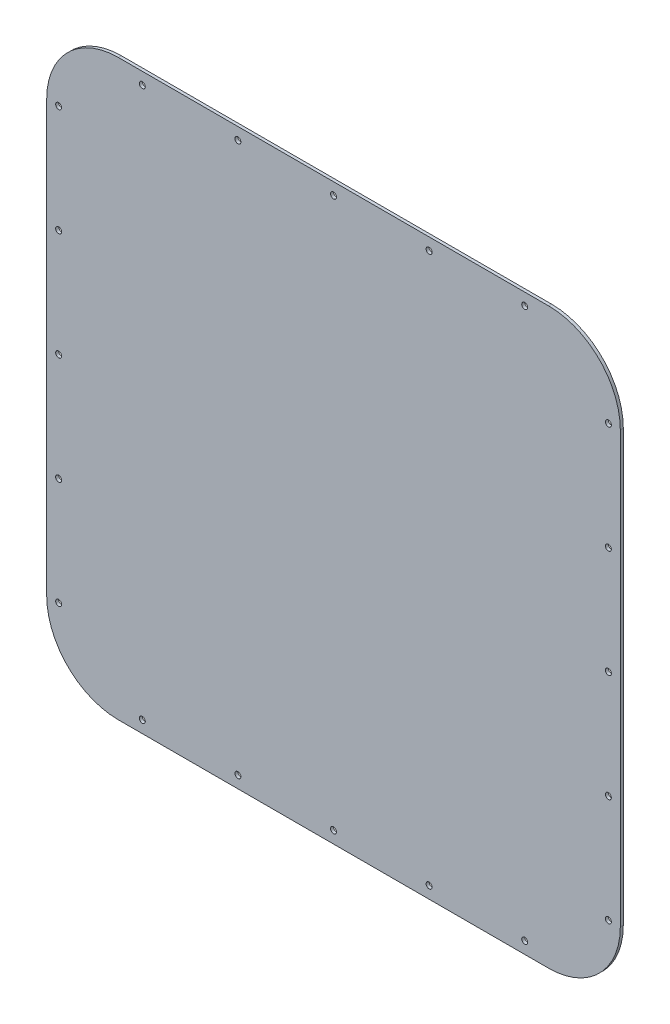
ISO-10303-21;
HEADER;
FILE_DESCRIPTION(('STEP AP214'),'2;1');
FILE_NAME('part.step','',(''),(''),'','','');
FILE_SCHEMA(('AUTOMOTIVE_DESIGN { 1 0 10303 214 1 1 1 1 }'));
ENDSEC;
DATA;
#1=APPLICATION_CONTEXT('core data for automotive mechanical design processes');
#2=APPLICATION_PROTOCOL_DEFINITION('international standard','automotive_design',2000,#1);
#3=PRODUCT_CONTEXT('',#1,'mechanical');
#4=PRODUCT('Part','Part','',(#3));
#5=PRODUCT_RELATED_PRODUCT_CATEGORY('part','',(#4));
#6=PRODUCT_DEFINITION_FORMATION('','',#4);
#7=PRODUCT_DEFINITION_CONTEXT('part definition',#1,'design');
#8=PRODUCT_DEFINITION('design','',#6,#7);
#9=PRODUCT_DEFINITION_SHAPE('','',#8);
#10=(LENGTH_UNIT() NAMED_UNIT(*) SI_UNIT(.MILLI.,.METRE.));
#11=(NAMED_UNIT(*) PLANE_ANGLE_UNIT() SI_UNIT($,.RADIAN.));
#12=(NAMED_UNIT(*) SI_UNIT($,.STERADIAN.) SOLID_ANGLE_UNIT());
#13=UNCERTAINTY_MEASURE_WITH_UNIT(LENGTH_MEASURE(1.E-05),#10,'distance_accuracy_value','');
#14=(GEOMETRIC_REPRESENTATION_CONTEXT(3) GLOBAL_UNCERTAINTY_ASSIGNED_CONTEXT((#13)) GLOBAL_UNIT_ASSIGNED_CONTEXT((#10,
#11,#12)) REPRESENTATION_CONTEXT('',''));
#15=CARTESIAN_POINT('',(0.,0.,0.));
#16=DIRECTION('',(0.,0.,1.));
#17=DIRECTION('',(1.,0.,0.));
#18=AXIS2_PLACEMENT_3D('',#15,#16,#17);
#19=CARTESIAN_POINT('',(-152.4,-1016.,3.175));
#20=DIRECTION('',(0.,0.,1.));
#21=DIRECTION('',(1.,0.,0.));
#22=AXIS2_PLACEMENT_3D('',#19,#20,#21);
#23=PLANE('',#22);
#24=CARTESIAN_POINT('',(-177.8,-1536.7,3.175));
#25=DIRECTION('',(0.,0.,1.));
#26=DIRECTION('',(1.,0.,0.));
#27=AXIS2_PLACEMENT_3D('',#24,#25,#26);
#28=CIRCLE('',#27,3.17500000000018);
#29=CARTESIAN_POINT('',(-174.625,-1536.7,3.175));
#30=VERTEX_POINT('',#29);
#31=EDGE_CURVE('E284',#30,#30,#28,.T.);
#32=ORIENTED_EDGE('',*,*,#31,.F.);
#33=EDGE_LOOP('',(#32));
#34=FACE_BOUND('',#33,.T.);
#35=CARTESIAN_POINT('',(-381.,-1536.7,3.175));
#36=DIRECTION('',(0.,0.,1.));
#37=DIRECTION('',(1.,0.,0.));
#38=AXIS2_PLACEMENT_3D('',#35,#36,#37);
#39=CIRCLE('',#38,3.17500000000015);
#40=CARTESIAN_POINT('',(-377.825,-1536.7,3.175));
#41=VERTEX_POINT('',#40);
#42=EDGE_CURVE('E272',#41,#41,#39,.T.);
#43=ORIENTED_EDGE('',*,*,#42,.F.);
#44=EDGE_LOOP('',(#43));
#45=FACE_BOUND('',#44,.T.);
#46=CARTESIAN_POINT('',(-673.1,-1130.53293067206,3.175));
#47=DIRECTION('',(0.,0.,1.));
#48=DIRECTION('',(1.,0.,0.));
#49=AXIS2_PLACEMENT_3D('',#46,#47,#48);
#50=CIRCLE('',#49,3.17500000000037);
#51=CARTESIAN_POINT('',(-669.924999999999,-1130.53293067206,3.175));
#52=VERTEX_POINT('',#51);
#53=EDGE_CURVE('E260',#52,#52,#50,.T.);
#54=ORIENTED_EDGE('',*,*,#53,.F.);
#55=EDGE_LOOP('',(#54));
#56=FACE_BOUND('',#55,.T.);
#57=CARTESIAN_POINT('',(-88.9,-1016.23293067206,3.175));
#58=DIRECTION('',(0.,0.,1.));
#59=DIRECTION('',(1.,0.,0.));
#60=AXIS2_PLACEMENT_3D('',#57,#58,#59);
#61=CIRCLE('',#60,3.17500000000076);
#62=CARTESIAN_POINT('',(-85.7249999999992,-1016.23293067206,3.175));
#63=VERTEX_POINT('',#62);
#64=EDGE_CURVE('E248',#63,#63,#61,.T.);
#65=ORIENTED_EDGE('',*,*,#64,.F.);
#66=EDGE_LOOP('',(#65));
#67=FACE_BOUND('',#66,.T.);
#68=CARTESIAN_POINT('',(-584.2,-952.5,3.175));
#69=DIRECTION('',(0.,0.,1.));
#70=DIRECTION('',(1.,0.,0.));
#71=AXIS2_PLACEMENT_3D('',#68,#69,#70);
#72=CIRCLE('',#71,3.17499999999982);
#73=CARTESIAN_POINT('',(-581.025,-952.5,3.175));
#74=VERTEX_POINT('',#73);
#75=EDGE_CURVE('E236',#74,#74,#72,.T.);
#76=ORIENTED_EDGE('',*,*,#75,.F.);
#77=EDGE_LOOP('',(#76));
#78=FACE_BOUND('',#77,.T.);
#79=CARTESIAN_POINT('',(-279.4,-952.5,3.175));
#80=DIRECTION('',(0.,0.,1.));
#81=DIRECTION('',(1.,0.,0.));
#82=AXIS2_PLACEMENT_3D('',#79,#80,#81);
#83=CIRCLE('',#82,3.17499999999976);
#84=CARTESIAN_POINT('',(-276.225,-952.5,3.175));
#85=VERTEX_POINT('',#84);
#86=EDGE_CURVE('E224',#85,#85,#83,.T.);
#87=ORIENTED_EDGE('',*,*,#86,.F.);
#88=EDGE_LOOP('',(#87));
#89=FACE_BOUND('',#88,.T.);
#90=CARTESIAN_POINT('',(-584.2,-1536.7,3.175));
#91=DIRECTION('',(0.,0.,1.));
#92=DIRECTION('',(1.,0.,0.));
#93=AXIS2_PLACEMENT_3D('',#90,#91,#92);
#94=CIRCLE('',#93,3.17500000000015);
#95=CARTESIAN_POINT('',(-581.025,-1536.7,3.175));
#96=VERTEX_POINT('',#95);
#97=EDGE_CURVE('E212',#96,#96,#94,.T.);
#98=ORIENTED_EDGE('',*,*,#97,.F.);
#99=EDGE_LOOP('',(#98));
#100=FACE_BOUND('',#99,.T.);
#101=CARTESIAN_POINT('',(-88.9,-1130.53293067206,3.175));
#102=DIRECTION('',(0.,0.,1.));
#103=DIRECTION('',(1.,0.,0.));
#104=AXIS2_PLACEMENT_3D('',#101,#102,#103);
#105=CIRCLE('',#104,3.17500000000015);
#106=CARTESIAN_POINT('',(-85.7249999999998,-1130.53293067206,3.175));
#107=VERTEX_POINT('',#106);
#108=EDGE_CURVE('E200',#107,#107,#105,.T.);
#109=ORIENTED_EDGE('',*,*,#108,.F.);
#110=EDGE_LOOP('',(#109));
#111=FACE_BOUND('',#110,.T.);
#112=CARTESIAN_POINT('',(-88.9,-1359.13293067206,3.175));
#113=DIRECTION('',(0.,0.,1.));
#114=DIRECTION('',(1.,0.,0.));
#115=AXIS2_PLACEMENT_3D('',#112,#113,#114);
#116=CIRCLE('',#115,3.17500000000026);
#117=CARTESIAN_POINT('',(-85.7249999999997,-1359.13293067206,3.175));
#118=VERTEX_POINT('',#117);
#119=EDGE_CURVE('E188',#118,#118,#116,.T.);
#120=ORIENTED_EDGE('',*,*,#119,.F.);
#121=EDGE_LOOP('',(#120));
#122=FACE_BOUND('',#121,.T.);
#123=CARTESIAN_POINT('',(-381.,-952.5,3.175));
#124=DIRECTION('',(0.,0.,1.));
#125=DIRECTION('',(1.,0.,0.));
#126=AXIS2_PLACEMENT_3D('',#123,#124,#125);
#127=CIRCLE('',#126,3.17499999999971);
#128=CARTESIAN_POINT('',(-377.825,-952.5,3.175));
#129=VERTEX_POINT('',#128);
#130=EDGE_CURVE('E134',#129,#129,#127,.T.);
#131=ORIENTED_EDGE('',*,*,#130,.F.);
#132=EDGE_LOOP('',(#131));
#133=FACE_BOUND('',#132,.T.);
#134=CARTESIAN_POINT('',(-152.4,-1016.,3.175));
#135=DIRECTION('',(0.,0.,1.));
#136=DIRECTION('',(1.,0.,0.));
#137=AXIS2_PLACEMENT_3D('',#134,#135,#136);
#138=CIRCLE('',#137,76.2);
#139=CARTESIAN_POINT('',(-76.2,-1016.,3.175));
#140=VERTEX_POINT('',#139);
#141=CARTESIAN_POINT('',(-152.4,-939.8,3.175));
#142=VERTEX_POINT('',#141);
#143=EDGE_CURVE('E145',#140,#142,#138,.T.);
#144=ORIENTED_EDGE('',*,*,#143,.T.);
#145=DIRECTION('',(-1.,0.,0.));
#146=VECTOR('',#145,1.);
#147=CARTESIAN_POINT('',(-152.4,-939.8,3.175));
#148=LINE('',#147,#146);
#149=CARTESIAN_POINT('',(-609.6,-939.8,3.175));
#150=VERTEX_POINT('',#149);
#151=EDGE_CURVE('E93',#142,#150,#148,.T.);
#152=ORIENTED_EDGE('',*,*,#151,.T.);
#153=CARTESIAN_POINT('',(-609.6,-1016.,3.175));
#154=DIRECTION('',(0.,0.,1.));
#155=DIRECTION('',(1.,0.,0.));
#156=AXIS2_PLACEMENT_3D('',#153,#154,#155);
#157=CIRCLE('',#156,76.2000000000003);
#158=CARTESIAN_POINT('',(-685.8,-1016.,3.175));
#159=VERTEX_POINT('',#158);
#160=EDGE_CURVE('E160',#150,#159,#157,.T.);
#161=ORIENTED_EDGE('',*,*,#160,.T.);
#162=DIRECTION('',(0.,-1.,0.));
#163=VECTOR('',#162,1.);
#164=CARTESIAN_POINT('',(-685.8,-1016.,3.175));
#165=LINE('',#164,#163);
#166=CARTESIAN_POINT('',(-685.8,-1473.2,3.175));
#167=VERTEX_POINT('',#166);
#168=EDGE_CURVE('E173',#159,#167,#165,.T.);
#169=ORIENTED_EDGE('',*,*,#168,.T.);
#170=CARTESIAN_POINT('',(-609.599999999999,-1473.2,3.175));
#171=DIRECTION('',(0.,0.,1.));
#172=DIRECTION('',(1.,0.,0.));
#173=AXIS2_PLACEMENT_3D('',#170,#171,#172);
#174=CIRCLE('',#173,76.2000000000005);
#175=CARTESIAN_POINT('',(-609.6,-1549.4,3.175));
#176=VERTEX_POINT('',#175);
#177=EDGE_CURVE('E112',#167,#176,#174,.T.);
#178=ORIENTED_EDGE('',*,*,#177,.T.);
#179=DIRECTION('',(1.,0.,0.));
#180=VECTOR('',#179,1.);
#181=CARTESIAN_POINT('',(-609.6,-1549.4,3.175));
#182=LINE('',#181,#180);
#183=CARTESIAN_POINT('',(-152.4,-1549.4,3.175));
#184=VERTEX_POINT('',#183);
#185=EDGE_CURVE('E106',#176,#184,#182,.T.);
#186=ORIENTED_EDGE('',*,*,#185,.T.);
#187=CARTESIAN_POINT('',(-152.4,-1473.2,3.175));
#188=DIRECTION('',(0.,0.,1.));
#189=DIRECTION('',(1.,0.,0.));
#190=AXIS2_PLACEMENT_3D('',#187,#188,#189);
#191=CIRCLE('',#190,76.2000000000005);
#192=CARTESIAN_POINT('',(-76.2,-1473.2,3.175));
#193=VERTEX_POINT('',#192);
#194=EDGE_CURVE('E110',#184,#193,#191,.T.);
#195=ORIENTED_EDGE('',*,*,#194,.T.);
#196=DIRECTION('',(0.,1.,0.));
#197=VECTOR('',#196,1.);
#198=CARTESIAN_POINT('',(-76.2,-1473.2,3.175));
#199=LINE('',#198,#197);
#200=EDGE_CURVE('E50',#193,#140,#199,.T.);
#201=ORIENTED_EDGE('',*,*,#200,.T.);
#202=EDGE_LOOP('',(#144,#152,#161,#169,#178,#186,#195,#201));
#203=FACE_BOUND('',#202,.T.);
#204=CARTESIAN_POINT('',(-88.9,-1473.43293067206,3.175));
#205=DIRECTION('',(0.,0.,1.));
#206=DIRECTION('',(1.,0.,0.));
#207=AXIS2_PLACEMENT_3D('',#204,#205,#206);
#208=CIRCLE('',#207,3.1750000000004);
#209=CARTESIAN_POINT('',(-85.7249999999996,-1473.43293067206,3.175));
#210=VERTEX_POINT('',#209);
#211=EDGE_CURVE('E182',#210,#210,#208,.T.);
#212=ORIENTED_EDGE('',*,*,#211,.F.);
#213=EDGE_LOOP('',(#212));
#214=FACE_BOUND('',#213,.T.);
#215=CARTESIAN_POINT('',(-88.9,-1244.83293067206,3.175));
#216=DIRECTION('',(0.,0.,1.));
#217=DIRECTION('',(1.,0.,0.));
#218=AXIS2_PLACEMENT_3D('',#215,#216,#217);
#219=CIRCLE('',#218,3.17500000000016);
#220=CARTESIAN_POINT('',(-85.7249999999998,-1244.83293067206,3.175));
#221=VERTEX_POINT('',#220);
#222=EDGE_CURVE('E194',#221,#221,#219,.T.);
#223=ORIENTED_EDGE('',*,*,#222,.F.);
#224=EDGE_LOOP('',(#223));
#225=FACE_BOUND('',#224,.T.);
#226=CARTESIAN_POINT('',(-482.6,-1536.7,3.175));
#227=DIRECTION('',(0.,0.,1.));
#228=DIRECTION('',(1.,0.,0.));
#229=AXIS2_PLACEMENT_3D('',#226,#227,#228);
#230=CIRCLE('',#229,3.17500000000009);
#231=CARTESIAN_POINT('',(-479.425,-1536.7,3.175));
#232=VERTEX_POINT('',#231);
#233=EDGE_CURVE('E206',#232,#232,#230,.T.);
#234=ORIENTED_EDGE('',*,*,#233,.F.);
#235=EDGE_LOOP('',(#234));
#236=FACE_BOUND('',#235,.T.);
#237=CARTESIAN_POINT('',(-673.1,-1244.83293067206,3.175));
#238=DIRECTION('',(0.,0.,1.));
#239=DIRECTION('',(1.,0.,0.));
#240=AXIS2_PLACEMENT_3D('',#237,#238,#239);
#241=CIRCLE('',#240,3.17499999999993);
#242=CARTESIAN_POINT('',(-669.925,-1244.83293067206,3.175));
#243=VERTEX_POINT('',#242);
#244=EDGE_CURVE('E218',#243,#243,#241,.T.);
#245=ORIENTED_EDGE('',*,*,#244,.F.);
#246=EDGE_LOOP('',(#245));
#247=FACE_BOUND('',#246,.T.);
#248=CARTESIAN_POINT('',(-482.6,-952.5,3.175));
#249=DIRECTION('',(0.,0.,1.));
#250=DIRECTION('',(1.,0.,0.));
#251=AXIS2_PLACEMENT_3D('',#248,#249,#250);
#252=CIRCLE('',#251,3.17499999999982);
#253=CARTESIAN_POINT('',(-479.425,-952.5,3.175));
#254=VERTEX_POINT('',#253);
#255=EDGE_CURVE('E230',#254,#254,#252,.T.);
#256=ORIENTED_EDGE('',*,*,#255,.F.);
#257=EDGE_LOOP('',(#256));
#258=FACE_BOUND('',#257,.T.);
#259=CARTESIAN_POINT('',(-177.8,-952.5,3.175));
#260=DIRECTION('',(0.,0.,1.));
#261=DIRECTION('',(1.,0.,0.));
#262=AXIS2_PLACEMENT_3D('',#259,#260,#261);
#263=CIRCLE('',#262,3.17499999999979);
#264=CARTESIAN_POINT('',(-174.625,-952.5,3.175));
#265=VERTEX_POINT('',#264);
#266=EDGE_CURVE('E242',#265,#265,#263,.T.);
#267=ORIENTED_EDGE('',*,*,#266,.F.);
#268=EDGE_LOOP('',(#267));
#269=FACE_BOUND('',#268,.T.);
#270=CARTESIAN_POINT('',(-673.1,-1016.23293067206,3.175));
#271=DIRECTION('',(0.,0.,1.));
#272=DIRECTION('',(1.,0.,0.));
#273=AXIS2_PLACEMENT_3D('',#270,#271,#272);
#274=CIRCLE('',#273,3.17500000000037);
#275=CARTESIAN_POINT('',(-669.924999999999,-1016.23293067206,3.175));
#276=VERTEX_POINT('',#275);
#277=EDGE_CURVE('E254',#276,#276,#274,.T.);
#278=ORIENTED_EDGE('',*,*,#277,.F.);
#279=EDGE_LOOP('',(#278));
#280=FACE_BOUND('',#279,.T.);
#281=CARTESIAN_POINT('',(-673.1,-1473.43293067206,3.175));
#282=DIRECTION('',(0.,0.,1.));
#283=DIRECTION('',(1.,0.,0.));
#284=AXIS2_PLACEMENT_3D('',#281,#282,#283);
#285=CIRCLE('',#284,3.17500000000026);
#286=CARTESIAN_POINT('',(-669.925,-1473.43293067206,3.175));
#287=VERTEX_POINT('',#286);
#288=EDGE_CURVE('E266',#287,#287,#285,.T.);
#289=ORIENTED_EDGE('',*,*,#288,.F.);
#290=EDGE_LOOP('',(#289));
#291=FACE_BOUND('',#290,.T.);
#292=CARTESIAN_POINT('',(-279.4,-1536.7,3.175));
#293=DIRECTION('',(0.,0.,1.));
#294=DIRECTION('',(1.,0.,0.));
#295=AXIS2_PLACEMENT_3D('',#292,#293,#294);
#296=CIRCLE('',#295,3.17500000000009);
#297=CARTESIAN_POINT('',(-276.225,-1536.7,3.175));
#298=VERTEX_POINT('',#297);
#299=EDGE_CURVE('E278',#298,#298,#296,.T.);
#300=ORIENTED_EDGE('',*,*,#299,.F.);
#301=EDGE_LOOP('',(#300));
#302=FACE_BOUND('',#301,.T.);
#303=CARTESIAN_POINT('',(-673.1,-1359.13293067206,3.175));
#304=DIRECTION('',(0.,0.,1.));
#305=DIRECTION('',(1.,0.,0.));
#306=AXIS2_PLACEMENT_3D('',#303,#304,#305);
#307=CIRCLE('',#306,3.17500000000048);
#308=CARTESIAN_POINT('',(-669.924999999999,-1359.13293067206,3.175));
#309=VERTEX_POINT('',#308);
#310=EDGE_CURVE('E290',#309,#309,#307,.T.);
#311=ORIENTED_EDGE('',*,*,#310,.F.);
#312=EDGE_LOOP('',(#311));
#313=FACE_BOUND('',#312,.T.);
#314=ADVANCED_FACE('F33',(#34,#45,#56,#67,#78,#89,#100,#111,#122,#133,#203,#214,#225,#236,#247,
#258,#269,#280,#291,#302,#313),#23,.T.);
#315=CARTESIAN_POINT('',(-152.4,-1016.,0.));
#316=DIRECTION('',(0.,0.,1.));
#317=DIRECTION('',(1.,0.,0.));
#318=AXIS2_PLACEMENT_3D('',#315,#316,#317);
#319=PLANE('',#318);
#320=CARTESIAN_POINT('',(-152.4,-1016.,0.));
#321=DIRECTION('',(0.,0.,1.));
#322=DIRECTION('',(1.,0.,0.));
#323=AXIS2_PLACEMENT_3D('',#320,#321,#322);
#324=CIRCLE('',#323,76.2);
#325=CARTESIAN_POINT('',(-76.2,-1016.,0.));
#326=VERTEX_POINT('',#325);
#327=CARTESIAN_POINT('',(-152.4,-939.8,0.));
#328=VERTEX_POINT('',#327);
#329=EDGE_CURVE('E130',#326,#328,#324,.T.);
#330=ORIENTED_EDGE('',*,*,#329,.F.);
#331=DIRECTION('',(0.,1.,0.));
#332=VECTOR('',#331,1.);
#333=CARTESIAN_POINT('',(-76.2,-1473.2,0.));
#334=LINE('',#333,#332);
#335=CARTESIAN_POINT('',(-76.2,-1473.2,0.));
#336=VERTEX_POINT('',#335);
#337=EDGE_CURVE('E85',#336,#326,#334,.T.);
#338=ORIENTED_EDGE('',*,*,#337,.F.);
#339=CARTESIAN_POINT('',(-152.4,-1473.2,0.));
#340=DIRECTION('',(0.,0.,1.));
#341=DIRECTION('',(1.,0.,0.));
#342=AXIS2_PLACEMENT_3D('',#339,#340,#341);
#343=CIRCLE('',#342,76.2000000000005);
#344=CARTESIAN_POINT('',(-152.4,-1549.4,0.));
#345=VERTEX_POINT('',#344);
#346=EDGE_CURVE('E79',#345,#336,#343,.T.);
#347=ORIENTED_EDGE('',*,*,#346,.F.);
#348=DIRECTION('',(1.,0.,0.));
#349=VECTOR('',#348,1.);
#350=CARTESIAN_POINT('',(-609.6,-1549.4,0.));
#351=LINE('',#350,#349);
#352=CARTESIAN_POINT('',(-609.6,-1549.4,0.));
#353=VERTEX_POINT('',#352);
#354=EDGE_CURVE('E120',#353,#345,#351,.T.);
#355=ORIENTED_EDGE('',*,*,#354,.F.);
#356=CARTESIAN_POINT('',(-609.599999999999,-1473.2,0.));
#357=DIRECTION('',(0.,0.,1.));
#358=DIRECTION('',(1.,0.,0.));
#359=AXIS2_PLACEMENT_3D('',#356,#357,#358);
#360=CIRCLE('',#359,76.2000000000005);
#361=CARTESIAN_POINT('',(-685.8,-1473.2,0.));
#362=VERTEX_POINT('',#361);
#363=EDGE_CURVE('E140',#362,#353,#360,.T.);
#364=ORIENTED_EDGE('',*,*,#363,.F.);
#365=DIRECTION('',(0.,-1.,0.));
#366=VECTOR('',#365,1.);
#367=CARTESIAN_POINT('',(-685.8,-1016.,0.));
#368=LINE('',#367,#366);
#369=CARTESIAN_POINT('',(-685.8,-1016.,0.));
#370=VERTEX_POINT('',#369);
#371=EDGE_CURVE('E138',#370,#362,#368,.T.);
#372=ORIENTED_EDGE('',*,*,#371,.F.);
#373=CARTESIAN_POINT('',(-609.6,-1016.,0.));
#374=DIRECTION('',(0.,0.,1.));
#375=DIRECTION('',(1.,0.,0.));
#376=AXIS2_PLACEMENT_3D('',#373,#374,#375);
#377=CIRCLE('',#376,76.2000000000003);
#378=CARTESIAN_POINT('',(-609.6,-939.8,0.));
#379=VERTEX_POINT('',#378);
#380=EDGE_CURVE('E136',#379,#370,#377,.T.);
#381=ORIENTED_EDGE('',*,*,#380,.F.);
#382=DIRECTION('',(-1.,0.,0.));
#383=VECTOR('',#382,1.);
#384=CARTESIAN_POINT('',(-152.4,-939.8,0.));
#385=LINE('',#384,#383);
#386=EDGE_CURVE('E133',#328,#379,#385,.T.);
#387=ORIENTED_EDGE('',*,*,#386,.F.);
#388=EDGE_LOOP('',(#330,#338,#347,#355,#364,#372,#381,#387));
#389=FACE_BOUND('',#388,.T.);
#390=CARTESIAN_POINT('',(-381.,-952.5,0.));
#391=DIRECTION('',(0.,0.,1.));
#392=DIRECTION('',(1.,0.,0.));
#393=AXIS2_PLACEMENT_3D('',#390,#391,#392);
#394=CIRCLE('',#393,3.17499999999971);
#395=CARTESIAN_POINT('',(-377.825,-952.5,0.));
#396=VERTEX_POINT('',#395);
#397=EDGE_CURVE('E179',#396,#396,#394,.T.);
#398=ORIENTED_EDGE('',*,*,#397,.T.);
#399=EDGE_LOOP('',(#398));
#400=FACE_BOUND('',#399,.T.);
#401=CARTESIAN_POINT('',(-88.9,-1473.43293067206,0.));
#402=DIRECTION('',(0.,0.,1.));
#403=DIRECTION('',(1.,0.,0.));
#404=AXIS2_PLACEMENT_3D('',#401,#402,#403);
#405=CIRCLE('',#404,3.1750000000004);
#406=CARTESIAN_POINT('',(-85.7249999999996,-1473.43293067206,0.));
#407=VERTEX_POINT('',#406);
#408=EDGE_CURVE('E185',#407,#407,#405,.T.);
#409=ORIENTED_EDGE('',*,*,#408,.T.);
#410=EDGE_LOOP('',(#409));
#411=FACE_BOUND('',#410,.T.);
#412=CARTESIAN_POINT('',(-88.9,-1359.13293067206,0.));
#413=DIRECTION('',(0.,0.,1.));
#414=DIRECTION('',(1.,0.,0.));
#415=AXIS2_PLACEMENT_3D('',#412,#413,#414);
#416=CIRCLE('',#415,3.17500000000026);
#417=CARTESIAN_POINT('',(-85.7249999999997,-1359.13293067206,0.));
#418=VERTEX_POINT('',#417);
#419=EDGE_CURVE('E191',#418,#418,#416,.T.);
#420=ORIENTED_EDGE('',*,*,#419,.T.);
#421=EDGE_LOOP('',(#420));
#422=FACE_BOUND('',#421,.T.);
#423=CARTESIAN_POINT('',(-88.9,-1244.83293067206,0.));
#424=DIRECTION('',(0.,0.,1.));
#425=DIRECTION('',(1.,0.,0.));
#426=AXIS2_PLACEMENT_3D('',#423,#424,#425);
#427=CIRCLE('',#426,3.17500000000016);
#428=CARTESIAN_POINT('',(-85.7249999999998,-1244.83293067206,0.));
#429=VERTEX_POINT('',#428);
#430=EDGE_CURVE('E197',#429,#429,#427,.T.);
#431=ORIENTED_EDGE('',*,*,#430,.T.);
#432=EDGE_LOOP('',(#431));
#433=FACE_BOUND('',#432,.T.);
#434=CARTESIAN_POINT('',(-88.9,-1130.53293067206,0.));
#435=DIRECTION('',(0.,0.,1.));
#436=DIRECTION('',(1.,0.,0.));
#437=AXIS2_PLACEMENT_3D('',#434,#435,#436);
#438=CIRCLE('',#437,3.17500000000015);
#439=CARTESIAN_POINT('',(-85.7249999999998,-1130.53293067206,0.));
#440=VERTEX_POINT('',#439);
#441=EDGE_CURVE('E203',#440,#440,#438,.T.);
#442=ORIENTED_EDGE('',*,*,#441,.T.);
#443=EDGE_LOOP('',(#442));
#444=FACE_BOUND('',#443,.T.);
#445=CARTESIAN_POINT('',(-482.6,-1536.7,0.));
#446=DIRECTION('',(0.,0.,1.));
#447=DIRECTION('',(1.,0.,0.));
#448=AXIS2_PLACEMENT_3D('',#445,#446,#447);
#449=CIRCLE('',#448,3.17500000000009);
#450=CARTESIAN_POINT('',(-479.425,-1536.7,0.));
#451=VERTEX_POINT('',#450);
#452=EDGE_CURVE('E209',#451,#451,#449,.T.);
#453=ORIENTED_EDGE('',*,*,#452,.T.);
#454=EDGE_LOOP('',(#453));
#455=FACE_BOUND('',#454,.T.);
#456=CARTESIAN_POINT('',(-584.2,-1536.7,0.));
#457=DIRECTION('',(0.,0.,1.));
#458=DIRECTION('',(1.,0.,0.));
#459=AXIS2_PLACEMENT_3D('',#456,#457,#458);
#460=CIRCLE('',#459,3.17500000000015);
#461=CARTESIAN_POINT('',(-581.025,-1536.7,0.));
#462=VERTEX_POINT('',#461);
#463=EDGE_CURVE('E215',#462,#462,#460,.T.);
#464=ORIENTED_EDGE('',*,*,#463,.T.);
#465=EDGE_LOOP('',(#464));
#466=FACE_BOUND('',#465,.T.);
#467=CARTESIAN_POINT('',(-673.1,-1244.83293067206,0.));
#468=DIRECTION('',(0.,0.,1.));
#469=DIRECTION('',(1.,0.,0.));
#470=AXIS2_PLACEMENT_3D('',#467,#468,#469);
#471=CIRCLE('',#470,3.17499999999993);
#472=CARTESIAN_POINT('',(-669.925,-1244.83293067206,0.));
#473=VERTEX_POINT('',#472);
#474=EDGE_CURVE('E221',#473,#473,#471,.T.);
#475=ORIENTED_EDGE('',*,*,#474,.T.);
#476=EDGE_LOOP('',(#475));
#477=FACE_BOUND('',#476,.T.);
#478=CARTESIAN_POINT('',(-279.4,-952.5,0.));
#479=DIRECTION('',(0.,0.,1.));
#480=DIRECTION('',(1.,0.,0.));
#481=AXIS2_PLACEMENT_3D('',#478,#479,#480);
#482=CIRCLE('',#481,3.17499999999976);
#483=CARTESIAN_POINT('',(-276.225,-952.5,0.));
#484=VERTEX_POINT('',#483);
#485=EDGE_CURVE('E227',#484,#484,#482,.T.);
#486=ORIENTED_EDGE('',*,*,#485,.T.);
#487=EDGE_LOOP('',(#486));
#488=FACE_BOUND('',#487,.T.);
#489=CARTESIAN_POINT('',(-482.6,-952.5,0.));
#490=DIRECTION('',(0.,0.,1.));
#491=DIRECTION('',(1.,0.,0.));
#492=AXIS2_PLACEMENT_3D('',#489,#490,#491);
#493=CIRCLE('',#492,3.17499999999982);
#494=CARTESIAN_POINT('',(-479.425,-952.5,0.));
#495=VERTEX_POINT('',#494);
#496=EDGE_CURVE('E233',#495,#495,#493,.T.);
#497=ORIENTED_EDGE('',*,*,#496,.T.);
#498=EDGE_LOOP('',(#497));
#499=FACE_BOUND('',#498,.T.);
#500=CARTESIAN_POINT('',(-584.2,-952.5,0.));
#501=DIRECTION('',(0.,0.,1.));
#502=DIRECTION('',(1.,0.,0.));
#503=AXIS2_PLACEMENT_3D('',#500,#501,#502);
#504=CIRCLE('',#503,3.17499999999982);
#505=CARTESIAN_POINT('',(-581.025,-952.5,0.));
#506=VERTEX_POINT('',#505);
#507=EDGE_CURVE('E239',#506,#506,#504,.T.);
#508=ORIENTED_EDGE('',*,*,#507,.T.);
#509=EDGE_LOOP('',(#508));
#510=FACE_BOUND('',#509,.T.);
#511=CARTESIAN_POINT('',(-177.8,-952.5,0.));
#512=DIRECTION('',(0.,0.,1.));
#513=DIRECTION('',(1.,0.,0.));
#514=AXIS2_PLACEMENT_3D('',#511,#512,#513);
#515=CIRCLE('',#514,3.17499999999979);
#516=CARTESIAN_POINT('',(-174.625,-952.5,0.));
#517=VERTEX_POINT('',#516);
#518=EDGE_CURVE('E245',#517,#517,#515,.T.);
#519=ORIENTED_EDGE('',*,*,#518,.T.);
#520=EDGE_LOOP('',(#519));
#521=FACE_BOUND('',#520,.T.);
#522=CARTESIAN_POINT('',(-88.9,-1016.23293067206,0.));
#523=DIRECTION('',(0.,0.,1.));
#524=DIRECTION('',(1.,0.,0.));
#525=AXIS2_PLACEMENT_3D('',#522,#523,#524);
#526=CIRCLE('',#525,3.17500000000076);
#527=CARTESIAN_POINT('',(-85.7249999999992,-1016.23293067206,0.));
#528=VERTEX_POINT('',#527);
#529=EDGE_CURVE('E251',#528,#528,#526,.T.);
#530=ORIENTED_EDGE('',*,*,#529,.T.);
#531=EDGE_LOOP('',(#530));
#532=FACE_BOUND('',#531,.T.);
#533=CARTESIAN_POINT('',(-673.1,-1016.23293067206,0.));
#534=DIRECTION('',(0.,0.,1.));
#535=DIRECTION('',(1.,0.,0.));
#536=AXIS2_PLACEMENT_3D('',#533,#534,#535);
#537=CIRCLE('',#536,3.17500000000037);
#538=CARTESIAN_POINT('',(-669.924999999999,-1016.23293067206,0.));
#539=VERTEX_POINT('',#538);
#540=EDGE_CURVE('E257',#539,#539,#537,.T.);
#541=ORIENTED_EDGE('',*,*,#540,.T.);
#542=EDGE_LOOP('',(#541));
#543=FACE_BOUND('',#542,.T.);
#544=CARTESIAN_POINT('',(-673.1,-1130.53293067206,0.));
#545=DIRECTION('',(0.,0.,1.));
#546=DIRECTION('',(1.,0.,0.));
#547=AXIS2_PLACEMENT_3D('',#544,#545,#546);
#548=CIRCLE('',#547,3.17500000000037);
#549=CARTESIAN_POINT('',(-669.924999999999,-1130.53293067206,0.));
#550=VERTEX_POINT('',#549);
#551=EDGE_CURVE('E263',#550,#550,#548,.T.);
#552=ORIENTED_EDGE('',*,*,#551,.T.);
#553=EDGE_LOOP('',(#552));
#554=FACE_BOUND('',#553,.T.);
#555=CARTESIAN_POINT('',(-673.1,-1473.43293067206,0.));
#556=DIRECTION('',(0.,0.,1.));
#557=DIRECTION('',(1.,0.,0.));
#558=AXIS2_PLACEMENT_3D('',#555,#556,#557);
#559=CIRCLE('',#558,3.17500000000026);
#560=CARTESIAN_POINT('',(-669.925,-1473.43293067206,0.));
#561=VERTEX_POINT('',#560);
#562=EDGE_CURVE('E269',#561,#561,#559,.T.);
#563=ORIENTED_EDGE('',*,*,#562,.T.);
#564=EDGE_LOOP('',(#563));
#565=FACE_BOUND('',#564,.T.);
#566=CARTESIAN_POINT('',(-381.,-1536.7,0.));
#567=DIRECTION('',(0.,0.,1.));
#568=DIRECTION('',(1.,0.,0.));
#569=AXIS2_PLACEMENT_3D('',#566,#567,#568);
#570=CIRCLE('',#569,3.17500000000015);
#571=CARTESIAN_POINT('',(-377.825,-1536.7,0.));
#572=VERTEX_POINT('',#571);
#573=EDGE_CURVE('E275',#572,#572,#570,.T.);
#574=ORIENTED_EDGE('',*,*,#573,.T.);
#575=EDGE_LOOP('',(#574));
#576=FACE_BOUND('',#575,.T.);
#577=CARTESIAN_POINT('',(-279.4,-1536.7,0.));
#578=DIRECTION('',(0.,0.,1.));
#579=DIRECTION('',(1.,0.,0.));
#580=AXIS2_PLACEMENT_3D('',#577,#578,#579);
#581=CIRCLE('',#580,3.17500000000009);
#582=CARTESIAN_POINT('',(-276.225,-1536.7,0.));
#583=VERTEX_POINT('',#582);
#584=EDGE_CURVE('E281',#583,#583,#581,.T.);
#585=ORIENTED_EDGE('',*,*,#584,.T.);
#586=EDGE_LOOP('',(#585));
#587=FACE_BOUND('',#586,.T.);
#588=CARTESIAN_POINT('',(-177.8,-1536.7,0.));
#589=DIRECTION('',(0.,0.,1.));
#590=DIRECTION('',(1.,0.,0.));
#591=AXIS2_PLACEMENT_3D('',#588,#589,#590);
#592=CIRCLE('',#591,3.17500000000018);
#593=CARTESIAN_POINT('',(-174.625,-1536.7,0.));
#594=VERTEX_POINT('',#593);
#595=EDGE_CURVE('E287',#594,#594,#592,.T.);
#596=ORIENTED_EDGE('',*,*,#595,.T.);
#597=EDGE_LOOP('',(#596));
#598=FACE_BOUND('',#597,.T.);
#599=CARTESIAN_POINT('',(-673.1,-1359.13293067206,0.));
#600=DIRECTION('',(0.,0.,1.));
#601=DIRECTION('',(1.,0.,0.));
#602=AXIS2_PLACEMENT_3D('',#599,#600,#601);
#603=CIRCLE('',#602,3.17500000000048);
#604=CARTESIAN_POINT('',(-669.924999999999,-1359.13293067206,0.));
#605=VERTEX_POINT('',#604);
#606=EDGE_CURVE('E293',#605,#605,#603,.T.);
#607=ORIENTED_EDGE('',*,*,#606,.T.);
#608=EDGE_LOOP('',(#607));
#609=FACE_BOUND('',#608,.T.);
#610=ADVANCED_FACE('F164',(#389,#400,#411,#422,#433,#444,#455,#466,#477,#488,#499,#510,#521,
#532,#543,#554,#565,#576,#587,#598,#609),#319,.F.);
#611=CARTESIAN_POINT('',(-152.4,-1016.,3.175));
#612=DIRECTION('',(0.,0.,-1.));
#613=DIRECTION('',(-1.,0.,0.));
#614=AXIS2_PLACEMENT_3D('',#611,#612,#613);
#615=CYLINDRICAL_SURFACE('',#614,76.2);
#616=ORIENTED_EDGE('',*,*,#329,.T.);
#617=DIRECTION('',(0.,0.,-1.));
#618=VECTOR('',#617,1.);
#619=CARTESIAN_POINT('',(-152.4,-939.8,3.175));
#620=LINE('',#619,#618);
#621=EDGE_CURVE('E11',#142,#328,#620,.T.);
#622=ORIENTED_EDGE('',*,*,#621,.F.);
#623=ORIENTED_EDGE('',*,*,#143,.F.);
#624=DIRECTION('',(0.,0.,-1.));
#625=VECTOR('',#624,1.);
#626=CARTESIAN_POINT('',(-76.2,-1016.,3.175));
#627=LINE('',#626,#625);
#628=EDGE_CURVE('E126',#140,#326,#627,.T.);
#629=ORIENTED_EDGE('',*,*,#628,.T.);
#630=EDGE_LOOP('',(#616,#622,#623,#629));
#631=FACE_BOUND('',#630,.T.);
#632=ADVANCED_FACE('F35',(#631),#615,.T.);
#633=CARTESIAN_POINT('',(-152.4,-939.8,3.175));
#634=DIRECTION('',(0.,-1.,0.));
#635=DIRECTION('',(0.,0.,-1.));
#636=AXIS2_PLACEMENT_3D('',#633,#634,#635);
#637=PLANE('',#636);
#638=ORIENTED_EDGE('',*,*,#386,.T.);
#639=DIRECTION('',(0.,0.,-1.));
#640=VECTOR('',#639,1.);
#641=CARTESIAN_POINT('',(-609.6,-939.8,3.175));
#642=LINE('',#641,#640);
#643=EDGE_CURVE('E42',#150,#379,#642,.T.);
#644=ORIENTED_EDGE('',*,*,#643,.F.);
#645=ORIENTED_EDGE('',*,*,#151,.F.);
#646=ORIENTED_EDGE('',*,*,#621,.T.);
#647=EDGE_LOOP('',(#638,#644,#645,#646));
#648=FACE_BOUND('',#647,.T.);
#649=ADVANCED_FACE('F327',(#648),#637,.F.);
#650=CARTESIAN_POINT('',(-609.6,-1016.,3.175));
#651=DIRECTION('',(0.,0.,-1.));
#652=DIRECTION('',(-1.,0.,0.));
#653=AXIS2_PLACEMENT_3D('',#650,#651,#652);
#654=CYLINDRICAL_SURFACE('',#653,76.2000000000003);
#655=ORIENTED_EDGE('',*,*,#380,.T.);
#656=DIRECTION('',(0.,0.,-1.));
#657=VECTOR('',#656,1.);
#658=CARTESIAN_POINT('',(-685.8,-1016.,3.175));
#659=LINE('',#658,#657);
#660=EDGE_CURVE('E152',#159,#370,#659,.T.);
#661=ORIENTED_EDGE('',*,*,#660,.F.);
#662=ORIENTED_EDGE('',*,*,#160,.F.);
#663=ORIENTED_EDGE('',*,*,#643,.T.);
#664=EDGE_LOOP('',(#655,#661,#662,#663));
#665=FACE_BOUND('',#664,.T.);
#666=ADVANCED_FACE('F158',(#665),#654,.T.);
#667=CARTESIAN_POINT('',(-685.8,-1016.,3.175));
#668=DIRECTION('',(1.,0.,0.));
#669=DIRECTION('',(0.,0.,-1.));
#670=AXIS2_PLACEMENT_3D('',#667,#668,#669);
#671=PLANE('',#670);
#672=ORIENTED_EDGE('',*,*,#371,.T.);
#673=DIRECTION('',(0.,0.,-1.));
#674=VECTOR('',#673,1.);
#675=CARTESIAN_POINT('',(-685.8,-1473.2,3.175));
#676=LINE('',#675,#674);
#677=EDGE_CURVE('E149',#167,#362,#676,.T.);
#678=ORIENTED_EDGE('',*,*,#677,.F.);
#679=ORIENTED_EDGE('',*,*,#168,.F.);
#680=ORIENTED_EDGE('',*,*,#660,.T.);
#681=EDGE_LOOP('',(#672,#678,#679,#680));
#682=FACE_BOUND('',#681,.T.);
#683=ADVANCED_FACE('F169',(#682),#671,.F.);
#684=CARTESIAN_POINT('',(-609.599999999999,-1473.2,3.175));
#685=DIRECTION('',(0.,0.,-1.));
#686=DIRECTION('',(-1.,0.,0.));
#687=AXIS2_PLACEMENT_3D('',#684,#685,#686);
#688=CYLINDRICAL_SURFACE('',#687,76.2000000000005);
#689=ORIENTED_EDGE('',*,*,#363,.T.);
#690=DIRECTION('',(0.,0.,-1.));
#691=VECTOR('',#690,1.);
#692=CARTESIAN_POINT('',(-609.6,-1549.4,3.175));
#693=LINE('',#692,#691);
#694=EDGE_CURVE('E121',#176,#353,#693,.T.);
#695=ORIENTED_EDGE('',*,*,#694,.F.);
#696=ORIENTED_EDGE('',*,*,#177,.F.);
#697=ORIENTED_EDGE('',*,*,#677,.T.);
#698=EDGE_LOOP('',(#689,#695,#696,#697));
#699=FACE_BOUND('',#698,.T.);
#700=ADVANCED_FACE('F172',(#699),#688,.T.);
#701=CARTESIAN_POINT('',(-609.6,-1549.4,3.175));
#702=DIRECTION('',(0.,1.,0.));
#703=DIRECTION('',(0.,0.,1.));
#704=AXIS2_PLACEMENT_3D('',#701,#702,#703);
#705=PLANE('',#704);
#706=ORIENTED_EDGE('',*,*,#354,.T.);
#707=DIRECTION('',(0.,0.,-1.));
#708=VECTOR('',#707,1.);
#709=CARTESIAN_POINT('',(-152.4,-1549.4,3.175));
#710=LINE('',#709,#708);
#711=EDGE_CURVE('E117',#184,#345,#710,.T.);
#712=ORIENTED_EDGE('',*,*,#711,.F.);
#713=ORIENTED_EDGE('',*,*,#185,.F.);
#714=ORIENTED_EDGE('',*,*,#694,.T.);
#715=EDGE_LOOP('',(#706,#712,#713,#714));
#716=FACE_BOUND('',#715,.T.);
#717=ADVANCED_FACE('F118',(#716),#705,.F.);
#718=CARTESIAN_POINT('',(-152.4,-1473.2,3.175));
#719=DIRECTION('',(0.,0.,-1.));
#720=DIRECTION('',(-1.,0.,0.));
#721=AXIS2_PLACEMENT_3D('',#718,#719,#720);
#722=CYLINDRICAL_SURFACE('',#721,76.2000000000005);
#723=ORIENTED_EDGE('',*,*,#346,.T.);
#724=DIRECTION('',(0.,0.,-1.));
#725=VECTOR('',#724,1.);
#726=CARTESIAN_POINT('',(-76.2,-1473.2,3.175));
#727=LINE('',#726,#725);
#728=EDGE_CURVE('E122',#193,#336,#727,.T.);
#729=ORIENTED_EDGE('',*,*,#728,.F.);
#730=ORIENTED_EDGE('',*,*,#194,.F.);
#731=ORIENTED_EDGE('',*,*,#711,.T.);
#732=EDGE_LOOP('',(#723,#729,#730,#731));
#733=FACE_BOUND('',#732,.T.);
#734=ADVANCED_FACE('F124',(#733),#722,.T.);
#735=CARTESIAN_POINT('',(-76.2,-1473.2,3.175));
#736=DIRECTION('',(-1.,0.,0.));
#737=DIRECTION('',(0.,0.,1.));
#738=AXIS2_PLACEMENT_3D('',#735,#736,#737);
#739=PLANE('',#738);
#740=ORIENTED_EDGE('',*,*,#337,.T.);
#741=ORIENTED_EDGE('',*,*,#628,.F.);
#742=ORIENTED_EDGE('',*,*,#200,.F.);
#743=ORIENTED_EDGE('',*,*,#728,.T.);
#744=EDGE_LOOP('',(#740,#741,#742,#743));
#745=FACE_BOUND('',#744,.T.);
#746=ADVANCED_FACE('F315',(#745),#739,.F.);
#747=CARTESIAN_POINT('',(-381.,-952.5,3.175));
#748=DIRECTION('',(0.,0.,-1.));
#749=DIRECTION('',(-1.,0.,0.));
#750=AXIS2_PLACEMENT_3D('',#747,#748,#749);
#751=CYLINDRICAL_SURFACE('',#750,3.17499999999971);
#752=ORIENTED_EDGE('',*,*,#130,.T.);
#753=EDGE_LOOP('',(#752));
#754=FACE_BOUND('',#753,.T.);
#755=ORIENTED_EDGE('',*,*,#397,.F.);
#756=EDGE_LOOP('',(#755));
#757=FACE_BOUND('',#756,.T.);
#758=ADVANCED_FACE('F312',(#754,#757),#751,.F.);
#759=CARTESIAN_POINT('',(-88.9,-1473.43293067206,3.175));
#760=DIRECTION('',(0.,0.,-1.));
#761=DIRECTION('',(-1.,0.,0.));
#762=AXIS2_PLACEMENT_3D('',#759,#760,#761);
#763=CYLINDRICAL_SURFACE('',#762,3.1750000000004);
#764=ORIENTED_EDGE('',*,*,#211,.T.);
#765=EDGE_LOOP('',(#764));
#766=FACE_BOUND('',#765,.T.);
#767=ORIENTED_EDGE('',*,*,#408,.F.);
#768=EDGE_LOOP('',(#767));
#769=FACE_BOUND('',#768,.T.);
#770=ADVANCED_FACE('F391',(#766,#769),#763,.F.);
#771=CARTESIAN_POINT('',(-88.9,-1359.13293067206,3.175));
#772=DIRECTION('',(0.,0.,-1.));
#773=DIRECTION('',(-1.,0.,0.));
#774=AXIS2_PLACEMENT_3D('',#771,#772,#773);
#775=CYLINDRICAL_SURFACE('',#774,3.17500000000026);
#776=ORIENTED_EDGE('',*,*,#119,.T.);
#777=EDGE_LOOP('',(#776));
#778=FACE_BOUND('',#777,.T.);
#779=ORIENTED_EDGE('',*,*,#419,.F.);
#780=EDGE_LOOP('',(#779));
#781=FACE_BOUND('',#780,.T.);
#782=ADVANCED_FACE('F399',(#778,#781),#775,.F.);
#783=CARTESIAN_POINT('',(-88.9,-1244.83293067206,3.175));
#784=DIRECTION('',(0.,0.,-1.));
#785=DIRECTION('',(-1.,0.,0.));
#786=AXIS2_PLACEMENT_3D('',#783,#784,#785);
#787=CYLINDRICAL_SURFACE('',#786,3.17500000000016);
#788=ORIENTED_EDGE('',*,*,#222,.T.);
#789=EDGE_LOOP('',(#788));
#790=FACE_BOUND('',#789,.T.);
#791=ORIENTED_EDGE('',*,*,#430,.F.);
#792=EDGE_LOOP('',(#791));
#793=FACE_BOUND('',#792,.T.);
#794=ADVANCED_FACE('F407',(#790,#793),#787,.F.);
#795=CARTESIAN_POINT('',(-88.9,-1130.53293067206,3.175));
#796=DIRECTION('',(0.,0.,-1.));
#797=DIRECTION('',(-1.,0.,0.));
#798=AXIS2_PLACEMENT_3D('',#795,#796,#797);
#799=CYLINDRICAL_SURFACE('',#798,3.17500000000015);
#800=ORIENTED_EDGE('',*,*,#108,.T.);
#801=EDGE_LOOP('',(#800));
#802=FACE_BOUND('',#801,.T.);
#803=ORIENTED_EDGE('',*,*,#441,.F.);
#804=EDGE_LOOP('',(#803));
#805=FACE_BOUND('',#804,.T.);
#806=ADVANCED_FACE('F416',(#802,#805),#799,.F.);
#807=CARTESIAN_POINT('',(-482.6,-1536.7,3.175));
#808=DIRECTION('',(0.,0.,-1.));
#809=DIRECTION('',(-1.,0.,0.));
#810=AXIS2_PLACEMENT_3D('',#807,#808,#809);
#811=CYLINDRICAL_SURFACE('',#810,3.17500000000009);
#812=ORIENTED_EDGE('',*,*,#233,.T.);
#813=EDGE_LOOP('',(#812));
#814=FACE_BOUND('',#813,.T.);
#815=ORIENTED_EDGE('',*,*,#452,.F.);
#816=EDGE_LOOP('',(#815));
#817=FACE_BOUND('',#816,.T.);
#818=ADVANCED_FACE('F425',(#814,#817),#811,.F.);
#819=CARTESIAN_POINT('',(-584.2,-1536.7,3.175));
#820=DIRECTION('',(0.,0.,-1.));
#821=DIRECTION('',(-1.,0.,0.));
#822=AXIS2_PLACEMENT_3D('',#819,#820,#821);
#823=CYLINDRICAL_SURFACE('',#822,3.17500000000015);
#824=ORIENTED_EDGE('',*,*,#97,.T.);
#825=EDGE_LOOP('',(#824));
#826=FACE_BOUND('',#825,.T.);
#827=ORIENTED_EDGE('',*,*,#463,.F.);
#828=EDGE_LOOP('',(#827));
#829=FACE_BOUND('',#828,.T.);
#830=ADVANCED_FACE('F434',(#826,#829),#823,.F.);
#831=CARTESIAN_POINT('',(-673.1,-1244.83293067206,3.175));
#832=DIRECTION('',(0.,0.,-1.));
#833=DIRECTION('',(-1.,0.,0.));
#834=AXIS2_PLACEMENT_3D('',#831,#832,#833);
#835=CYLINDRICAL_SURFACE('',#834,3.17499999999993);
#836=ORIENTED_EDGE('',*,*,#244,.T.);
#837=EDGE_LOOP('',(#836));
#838=FACE_BOUND('',#837,.T.);
#839=ORIENTED_EDGE('',*,*,#474,.F.);
#840=EDGE_LOOP('',(#839));
#841=FACE_BOUND('',#840,.T.);
#842=ADVANCED_FACE('F443',(#838,#841),#835,.F.);
#843=CARTESIAN_POINT('',(-279.4,-952.5,3.175));
#844=DIRECTION('',(0.,0.,-1.));
#845=DIRECTION('',(-1.,0.,0.));
#846=AXIS2_PLACEMENT_3D('',#843,#844,#845);
#847=CYLINDRICAL_SURFACE('',#846,3.17499999999976);
#848=ORIENTED_EDGE('',*,*,#86,.T.);
#849=EDGE_LOOP('',(#848));
#850=FACE_BOUND('',#849,.T.);
#851=ORIENTED_EDGE('',*,*,#485,.F.);
#852=EDGE_LOOP('',(#851));
#853=FACE_BOUND('',#852,.T.);
#854=ADVANCED_FACE('F452',(#850,#853),#847,.F.);
#855=CARTESIAN_POINT('',(-482.6,-952.5,3.175));
#856=DIRECTION('',(0.,0.,-1.));
#857=DIRECTION('',(-1.,0.,0.));
#858=AXIS2_PLACEMENT_3D('',#855,#856,#857);
#859=CYLINDRICAL_SURFACE('',#858,3.17499999999982);
#860=ORIENTED_EDGE('',*,*,#255,.T.);
#861=EDGE_LOOP('',(#860));
#862=FACE_BOUND('',#861,.T.);
#863=ORIENTED_EDGE('',*,*,#496,.F.);
#864=EDGE_LOOP('',(#863));
#865=FACE_BOUND('',#864,.T.);
#866=ADVANCED_FACE('F461',(#862,#865),#859,.F.);
#867=CARTESIAN_POINT('',(-584.2,-952.5,3.175));
#868=DIRECTION('',(0.,0.,-1.));
#869=DIRECTION('',(-1.,0.,0.));
#870=AXIS2_PLACEMENT_3D('',#867,#868,#869);
#871=CYLINDRICAL_SURFACE('',#870,3.17499999999982);
#872=ORIENTED_EDGE('',*,*,#75,.T.);
#873=EDGE_LOOP('',(#872));
#874=FACE_BOUND('',#873,.T.);
#875=ORIENTED_EDGE('',*,*,#507,.F.);
#876=EDGE_LOOP('',(#875));
#877=FACE_BOUND('',#876,.T.);
#878=ADVANCED_FACE('F470',(#874,#877),#871,.F.);
#879=CARTESIAN_POINT('',(-177.8,-952.5,3.175));
#880=DIRECTION('',(0.,0.,-1.));
#881=DIRECTION('',(-1.,0.,0.));
#882=AXIS2_PLACEMENT_3D('',#879,#880,#881);
#883=CYLINDRICAL_SURFACE('',#882,3.17499999999979);
#884=ORIENTED_EDGE('',*,*,#266,.T.);
#885=EDGE_LOOP('',(#884));
#886=FACE_BOUND('',#885,.T.);
#887=ORIENTED_EDGE('',*,*,#518,.F.);
#888=EDGE_LOOP('',(#887));
#889=FACE_BOUND('',#888,.T.);
#890=ADVANCED_FACE('F479',(#886,#889),#883,.F.);
#891=CARTESIAN_POINT('',(-88.9,-1016.23293067206,3.175));
#892=DIRECTION('',(0.,0.,-1.));
#893=DIRECTION('',(-1.,0.,0.));
#894=AXIS2_PLACEMENT_3D('',#891,#892,#893);
#895=CYLINDRICAL_SURFACE('',#894,3.17500000000076);
#896=ORIENTED_EDGE('',*,*,#64,.T.);
#897=EDGE_LOOP('',(#896));
#898=FACE_BOUND('',#897,.T.);
#899=ORIENTED_EDGE('',*,*,#529,.F.);
#900=EDGE_LOOP('',(#899));
#901=FACE_BOUND('',#900,.T.);
#902=ADVANCED_FACE('F488',(#898,#901),#895,.F.);
#903=CARTESIAN_POINT('',(-673.1,-1016.23293067206,3.175));
#904=DIRECTION('',(0.,0.,-1.));
#905=DIRECTION('',(-1.,0.,0.));
#906=AXIS2_PLACEMENT_3D('',#903,#904,#905);
#907=CYLINDRICAL_SURFACE('',#906,3.17500000000037);
#908=ORIENTED_EDGE('',*,*,#277,.T.);
#909=EDGE_LOOP('',(#908));
#910=FACE_BOUND('',#909,.T.);
#911=ORIENTED_EDGE('',*,*,#540,.F.);
#912=EDGE_LOOP('',(#911));
#913=FACE_BOUND('',#912,.T.);
#914=ADVANCED_FACE('F497',(#910,#913),#907,.F.);
#915=CARTESIAN_POINT('',(-673.1,-1130.53293067206,3.175));
#916=DIRECTION('',(0.,0.,-1.));
#917=DIRECTION('',(-1.,0.,0.));
#918=AXIS2_PLACEMENT_3D('',#915,#916,#917);
#919=CYLINDRICAL_SURFACE('',#918,3.17500000000037);
#920=ORIENTED_EDGE('',*,*,#53,.T.);
#921=EDGE_LOOP('',(#920));
#922=FACE_BOUND('',#921,.T.);
#923=ORIENTED_EDGE('',*,*,#551,.F.);
#924=EDGE_LOOP('',(#923));
#925=FACE_BOUND('',#924,.T.);
#926=ADVANCED_FACE('F506',(#922,#925),#919,.F.);
#927=CARTESIAN_POINT('',(-673.1,-1473.43293067206,3.175));
#928=DIRECTION('',(0.,0.,-1.));
#929=DIRECTION('',(-1.,0.,0.));
#930=AXIS2_PLACEMENT_3D('',#927,#928,#929);
#931=CYLINDRICAL_SURFACE('',#930,3.17500000000026);
#932=ORIENTED_EDGE('',*,*,#288,.T.);
#933=EDGE_LOOP('',(#932));
#934=FACE_BOUND('',#933,.T.);
#935=ORIENTED_EDGE('',*,*,#562,.F.);
#936=EDGE_LOOP('',(#935));
#937=FACE_BOUND('',#936,.T.);
#938=ADVANCED_FACE('F515',(#934,#937),#931,.F.);
#939=CARTESIAN_POINT('',(-381.,-1536.7,3.175));
#940=DIRECTION('',(0.,0.,-1.));
#941=DIRECTION('',(-1.,0.,0.));
#942=AXIS2_PLACEMENT_3D('',#939,#940,#941);
#943=CYLINDRICAL_SURFACE('',#942,3.17500000000015);
#944=ORIENTED_EDGE('',*,*,#42,.T.);
#945=EDGE_LOOP('',(#944));
#946=FACE_BOUND('',#945,.T.);
#947=ORIENTED_EDGE('',*,*,#573,.F.);
#948=EDGE_LOOP('',(#947));
#949=FACE_BOUND('',#948,.T.);
#950=ADVANCED_FACE('F524',(#946,#949),#943,.F.);
#951=CARTESIAN_POINT('',(-279.4,-1536.7,3.175));
#952=DIRECTION('',(0.,0.,-1.));
#953=DIRECTION('',(-1.,0.,0.));
#954=AXIS2_PLACEMENT_3D('',#951,#952,#953);
#955=CYLINDRICAL_SURFACE('',#954,3.17500000000009);
#956=ORIENTED_EDGE('',*,*,#299,.T.);
#957=EDGE_LOOP('',(#956));
#958=FACE_BOUND('',#957,.T.);
#959=ORIENTED_EDGE('',*,*,#584,.F.);
#960=EDGE_LOOP('',(#959));
#961=FACE_BOUND('',#960,.T.);
#962=ADVANCED_FACE('F533',(#958,#961),#955,.F.);
#963=CARTESIAN_POINT('',(-177.8,-1536.7,3.175));
#964=DIRECTION('',(0.,0.,-1.));
#965=DIRECTION('',(-1.,0.,0.));
#966=AXIS2_PLACEMENT_3D('',#963,#964,#965);
#967=CYLINDRICAL_SURFACE('',#966,3.17500000000018);
#968=ORIENTED_EDGE('',*,*,#31,.T.);
#969=EDGE_LOOP('',(#968));
#970=FACE_BOUND('',#969,.T.);
#971=ORIENTED_EDGE('',*,*,#595,.F.);
#972=EDGE_LOOP('',(#971));
#973=FACE_BOUND('',#972,.T.);
#974=ADVANCED_FACE('F542',(#970,#973),#967,.F.);
#975=CARTESIAN_POINT('',(-673.1,-1359.13293067206,3.175));
#976=DIRECTION('',(0.,0.,-1.));
#977=DIRECTION('',(-1.,0.,0.));
#978=AXIS2_PLACEMENT_3D('',#975,#976,#977);
#979=CYLINDRICAL_SURFACE('',#978,3.17500000000048);
#980=ORIENTED_EDGE('',*,*,#310,.T.);
#981=EDGE_LOOP('',(#980));
#982=FACE_BOUND('',#981,.T.);
#983=ORIENTED_EDGE('',*,*,#606,.F.);
#984=EDGE_LOOP('',(#983));
#985=FACE_BOUND('',#984,.T.);
#986=ADVANCED_FACE('F299',(#982,#985),#979,.F.);
#987=CLOSED_SHELL('',(#314,#610,#632,#649,#666,#683,#700,#717,#734,#746,#758,#770,#782,#794,
#806,#818,#830,#842,#854,#866,#878,#890,#902,#914,#926,#938,#950,#962,#974,#986));
#988=MANIFOLD_SOLID_BREP('B2',#987);
#989=ADVANCED_BREP_SHAPE_REPRESENTATION('',(#18,#988),#14);
#990=SHAPE_DEFINITION_REPRESENTATION(#9,#989);
ENDSEC;
END-ISO-10303-21;
